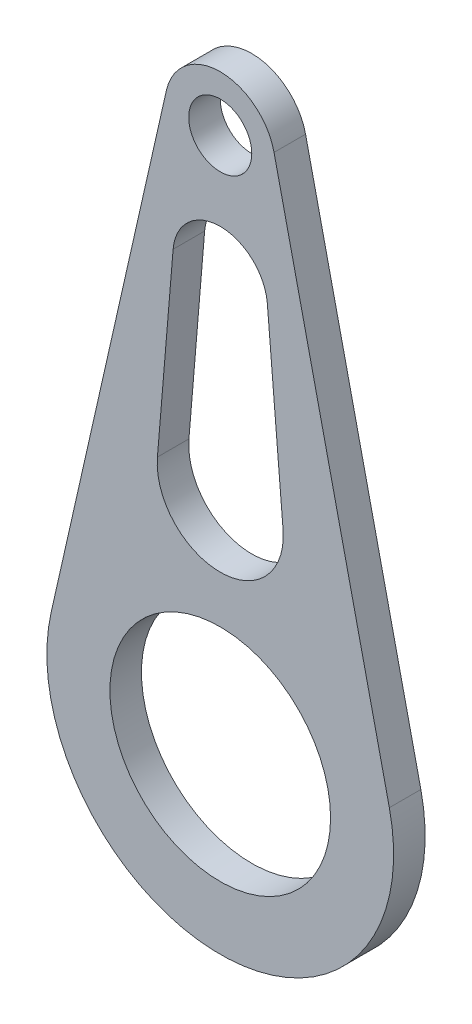
ISO-10303-21;
HEADER;
FILE_DESCRIPTION(('STEP AP214'),'2;1');
FILE_NAME('part.step','',(''),(''),'','','');
FILE_SCHEMA(('AUTOMOTIVE_DESIGN { 1 0 10303 214 1 1 1 1 }'));
ENDSEC;
DATA;
#1=APPLICATION_CONTEXT('core data for automotive mechanical design processes');
#2=APPLICATION_PROTOCOL_DEFINITION('international standard','automotive_design',2000,#1);
#3=PRODUCT_CONTEXT('',#1,'mechanical');
#4=PRODUCT('Part','Part','',(#3));
#5=PRODUCT_RELATED_PRODUCT_CATEGORY('part','',(#4));
#6=PRODUCT_DEFINITION_FORMATION('','',#4);
#7=PRODUCT_DEFINITION_CONTEXT('part definition',#1,'design');
#8=PRODUCT_DEFINITION('design','',#6,#7);
#9=PRODUCT_DEFINITION_SHAPE('','',#8);
#10=(LENGTH_UNIT() NAMED_UNIT(*) SI_UNIT(.MILLI.,.METRE.));
#11=(NAMED_UNIT(*) PLANE_ANGLE_UNIT() SI_UNIT($,.RADIAN.));
#12=(NAMED_UNIT(*) SI_UNIT($,.STERADIAN.) SOLID_ANGLE_UNIT());
#13=UNCERTAINTY_MEASURE_WITH_UNIT(LENGTH_MEASURE(1.E-05),#10,'distance_accuracy_value','');
#14=(GEOMETRIC_REPRESENTATION_CONTEXT(3) GLOBAL_UNCERTAINTY_ASSIGNED_CONTEXT((#13)) GLOBAL_UNIT_ASSIGNED_CONTEXT((#10,
#11,#12)) REPRESENTATION_CONTEXT('',''));
#15=CARTESIAN_POINT('',(0.,0.,0.));
#16=DIRECTION('',(0.,0.,1.));
#17=DIRECTION('',(1.,0.,0.));
#18=AXIS2_PLACEMENT_3D('',#15,#16,#17);
#19=CARTESIAN_POINT('',(0.,34.,2.));
#20=DIRECTION('',(0.,0.,1.));
#21=DIRECTION('',(1.,0.,0.));
#22=AXIS2_PLACEMENT_3D('',#19,#20,#21);
#23=PLANE('',#22);
#24=DIRECTION('',(-0.0833333333333333,0.996521728591783,0.));
#25=VECTOR('',#24,1.);
#26=CARTESIAN_POINT('',(2.98956518577535,26.25,2.));
#27=LINE('',#26,#25);
#28=CARTESIAN_POINT('',(3.98608691436713,14.3333333333333,2.));
#29=VERTEX_POINT('',#28);
#30=CARTESIAN_POINT('',(2.98956518577535,26.25,2.));
#31=VERTEX_POINT('',#30);
#32=EDGE_CURVE('E107',#29,#31,#27,.T.);
#33=ORIENTED_EDGE('',*,*,#32,.F.);
#34=CARTESIAN_POINT('',(0.,14.,2.));
#35=DIRECTION('',(0.,0.,1.));
#36=DIRECTION('',(1.,0.,0.));
#37=AXIS2_PLACEMENT_3D('',#34,#35,#36);
#38=CIRCLE('',#37,4.);
#39=CARTESIAN_POINT('',(-3.98608691436713,14.3333333333333,2.));
#40=VERTEX_POINT('',#39);
#41=EDGE_CURVE('E99',#40,#29,#38,.T.);
#42=ORIENTED_EDGE('',*,*,#41,.F.);
#43=DIRECTION('',(-0.0833333333333335,-0.996521728591783,0.));
#44=VECTOR('',#43,1.);
#45=CARTESIAN_POINT('',(-2.98956518577535,26.25,2.));
#46=LINE('',#45,#44);
#47=CARTESIAN_POINT('',(-2.98956518577535,26.25,2.));
#48=VERTEX_POINT('',#47);
#49=EDGE_CURVE('E122',#48,#40,#46,.T.);
#50=ORIENTED_EDGE('',*,*,#49,.F.);
#51=CARTESIAN_POINT('',(0.,26.,2.));
#52=DIRECTION('',(0.,0.,1.));
#53=DIRECTION('',(1.,0.,0.));
#54=AXIS2_PLACEMENT_3D('',#51,#52,#53);
#55=CIRCLE('',#54,3.);
#56=EDGE_CURVE('E120',#31,#48,#55,.T.);
#57=ORIENTED_EDGE('',*,*,#56,.F.);
#58=EDGE_LOOP('',(#33,#42,#50,#57));
#59=FACE_BOUND('',#58,.T.);
#60=CARTESIAN_POINT('',(0.,0.,2.));
#61=DIRECTION('',(0.,0.,1.));
#62=DIRECTION('',(1.,0.,0.));
#63=AXIS2_PLACEMENT_3D('',#60,#61,#62);
#64=CIRCLE('',#63,7.);
#65=CARTESIAN_POINT('',(7.,0.,2.));
#66=VERTEX_POINT('',#65);
#67=EDGE_CURVE('E138',#66,#66,#64,.T.);
#68=ORIENTED_EDGE('',*,*,#67,.F.);
#69=EDGE_LOOP('',(#68));
#70=FACE_BOUND('',#69,.T.);
#71=CARTESIAN_POINT('',(0.,34.,2.));
#72=DIRECTION('',(0.,0.,1.));
#73=DIRECTION('',(1.,0.,0.));
#74=AXIS2_PLACEMENT_3D('',#71,#72,#73);
#75=CIRCLE('',#74,3.5);
#76=CARTESIAN_POINT('',(3.41378458210391,34.7720588235294,2.));
#77=VERTEX_POINT('',#76);
#78=CARTESIAN_POINT('',(-3.41378458210391,34.7720588235294,2.));
#79=VERTEX_POINT('',#78);
#80=EDGE_CURVE('E144',#77,#79,#75,.T.);
#81=ORIENTED_EDGE('',*,*,#80,.T.);
#82=DIRECTION('',(-0.220588235294118,-0.975367023458261,0.));
#83=VECTOR('',#82,1.);
#84=CARTESIAN_POINT('',(-3.41378458210391,34.7720588235294,2.));
#85=LINE('',#84,#83);
#86=CARTESIAN_POINT('',(-10.7290372580409,2.42647058823529,2.));
#87=VERTEX_POINT('',#86);
#88=EDGE_CURVE('E147',#79,#87,#85,.T.);
#89=ORIENTED_EDGE('',*,*,#88,.T.);
#90=CARTESIAN_POINT('',(0.,0.,2.));
#91=DIRECTION('',(0.,0.,1.));
#92=DIRECTION('',(1.,0.,0.));
#93=AXIS2_PLACEMENT_3D('',#90,#91,#92);
#94=CIRCLE('',#93,11.);
#95=CARTESIAN_POINT('',(10.7290372580409,2.42647058823529,2.));
#96=VERTEX_POINT('',#95);
#97=EDGE_CURVE('E150',#87,#96,#94,.T.);
#98=ORIENTED_EDGE('',*,*,#97,.T.);
#99=DIRECTION('',(-0.220588235294117,0.975367023458261,0.));
#100=VECTOR('',#99,1.);
#101=CARTESIAN_POINT('',(3.41378458210391,34.7720588235294,2.));
#102=LINE('',#101,#100);
#103=EDGE_CURVE('E152',#96,#77,#102,.T.);
#104=ORIENTED_EDGE('',*,*,#103,.T.);
#105=EDGE_LOOP('',(#81,#89,#98,#104));
#106=FACE_BOUND('',#105,.T.);
#107=CARTESIAN_POINT('',(0.,34.,2.));
#108=DIRECTION('',(0.,0.,1.));
#109=DIRECTION('',(1.,0.,0.));
#110=AXIS2_PLACEMENT_3D('',#107,#108,#109);
#111=CIRCLE('',#110,2.);
#112=CARTESIAN_POINT('',(2.,34.,2.));
#113=VERTEX_POINT('',#112);
#114=EDGE_CURVE('E128',#113,#113,#111,.T.);
#115=ORIENTED_EDGE('',*,*,#114,.F.);
#116=EDGE_LOOP('',(#115));
#117=FACE_BOUND('',#116,.T.);
#118=ADVANCED_FACE('F34',(#59,#70,#106,#117),#23,.T.);
#119=CARTESIAN_POINT('',(0.,34.,0.));
#120=DIRECTION('',(0.,0.,1.));
#121=DIRECTION('',(1.,0.,0.));
#122=AXIS2_PLACEMENT_3D('',#119,#120,#121);
#123=PLANE('',#122);
#124=CARTESIAN_POINT('',(0.,0.,0.));
#125=DIRECTION('',(0.,0.,1.));
#126=DIRECTION('',(1.,0.,0.));
#127=AXIS2_PLACEMENT_3D('',#124,#125,#126);
#128=CIRCLE('',#127,7.);
#129=CARTESIAN_POINT('',(7.,0.,0.));
#130=VERTEX_POINT('',#129);
#131=EDGE_CURVE('E115',#130,#130,#128,.T.);
#132=ORIENTED_EDGE('',*,*,#131,.T.);
#133=EDGE_LOOP('',(#132));
#134=FACE_BOUND('',#133,.T.);
#135=CARTESIAN_POINT('',(0.,34.,0.));
#136=DIRECTION('',(0.,0.,1.));
#137=DIRECTION('',(1.,0.,0.));
#138=AXIS2_PLACEMENT_3D('',#135,#136,#137);
#139=CIRCLE('',#138,3.5);
#140=CARTESIAN_POINT('',(3.41378458210391,34.7720588235294,0.));
#141=VERTEX_POINT('',#140);
#142=CARTESIAN_POINT('',(-3.41378458210391,34.7720588235294,0.));
#143=VERTEX_POINT('',#142);
#144=EDGE_CURVE('E141',#141,#143,#139,.T.);
#145=ORIENTED_EDGE('',*,*,#144,.F.);
#146=DIRECTION('',(-0.220588235294117,0.975367023458261,0.));
#147=VECTOR('',#146,1.);
#148=CARTESIAN_POINT('',(3.41378458210391,34.7720588235294,0.));
#149=LINE('',#148,#147);
#150=CARTESIAN_POINT('',(10.7290372580409,2.42647058823529,0.));
#151=VERTEX_POINT('',#150);
#152=EDGE_CURVE('E148',#151,#141,#149,.T.);
#153=ORIENTED_EDGE('',*,*,#152,.F.);
#154=CARTESIAN_POINT('',(0.,0.,0.));
#155=DIRECTION('',(0.,0.,1.));
#156=DIRECTION('',(1.,0.,0.));
#157=AXIS2_PLACEMENT_3D('',#154,#155,#156);
#158=CIRCLE('',#157,11.);
#159=CARTESIAN_POINT('',(-10.7290372580409,2.42647058823529,0.));
#160=VERTEX_POINT('',#159);
#161=EDGE_CURVE('E159',#160,#151,#158,.T.);
#162=ORIENTED_EDGE('',*,*,#161,.F.);
#163=DIRECTION('',(-0.220588235294118,-0.975367023458261,0.));
#164=VECTOR('',#163,1.);
#165=CARTESIAN_POINT('',(-3.41378458210391,34.7720588235294,0.));
#166=LINE('',#165,#164);
#167=EDGE_CURVE('E157',#143,#160,#166,.T.);
#168=ORIENTED_EDGE('',*,*,#167,.F.);
#169=EDGE_LOOP('',(#145,#153,#162,#168));
#170=FACE_BOUND('',#169,.T.);
#171=CARTESIAN_POINT('',(0.,14.,0.));
#172=DIRECTION('',(0.,0.,1.));
#173=DIRECTION('',(1.,0.,0.));
#174=AXIS2_PLACEMENT_3D('',#171,#172,#173);
#175=CIRCLE('',#174,4.);
#176=CARTESIAN_POINT('',(-3.98608691436713,14.3333333333333,0.));
#177=VERTEX_POINT('',#176);
#178=CARTESIAN_POINT('',(3.98608691436713,14.3333333333333,0.));
#179=VERTEX_POINT('',#178);
#180=EDGE_CURVE('E57',#177,#179,#175,.T.);
#181=ORIENTED_EDGE('',*,*,#180,.T.);
#182=DIRECTION('',(-0.0833333333333333,0.996521728591783,0.));
#183=VECTOR('',#182,1.);
#184=CARTESIAN_POINT('',(2.98956518577535,26.25,0.));
#185=LINE('',#184,#183);
#186=CARTESIAN_POINT('',(2.98956518577535,26.25,0.));
#187=VERTEX_POINT('',#186);
#188=EDGE_CURVE('E114',#179,#187,#185,.T.);
#189=ORIENTED_EDGE('',*,*,#188,.T.);
#190=CARTESIAN_POINT('',(0.,26.,0.));
#191=DIRECTION('',(0.,0.,1.));
#192=DIRECTION('',(1.,0.,0.));
#193=AXIS2_PLACEMENT_3D('',#190,#191,#192);
#194=CIRCLE('',#193,3.);
#195=CARTESIAN_POINT('',(-2.98956518577535,26.25,0.));
#196=VERTEX_POINT('',#195);
#197=EDGE_CURVE('E130',#187,#196,#194,.T.);
#198=ORIENTED_EDGE('',*,*,#197,.T.);
#199=DIRECTION('',(-0.0833333333333335,-0.996521728591783,0.));
#200=VECTOR('',#199,1.);
#201=CARTESIAN_POINT('',(-2.98956518577535,26.25,0.));
#202=LINE('',#201,#200);
#203=EDGE_CURVE('E108',#196,#177,#202,.T.);
#204=ORIENTED_EDGE('',*,*,#203,.T.);
#205=EDGE_LOOP('',(#181,#189,#198,#204));
#206=FACE_BOUND('',#205,.T.);
#207=CARTESIAN_POINT('',(0.,34.,0.));
#208=DIRECTION('',(0.,0.,1.));
#209=DIRECTION('',(1.,0.,0.));
#210=AXIS2_PLACEMENT_3D('',#207,#208,#209);
#211=CIRCLE('',#210,2.);
#212=CARTESIAN_POINT('',(2.,34.,0.));
#213=VERTEX_POINT('',#212);
#214=EDGE_CURVE('E239',#213,#213,#211,.T.);
#215=ORIENTED_EDGE('',*,*,#214,.T.);
#216=EDGE_LOOP('',(#215));
#217=FACE_BOUND('',#216,.T.);
#218=ADVANCED_FACE('F177',(#134,#170,#206,#217),#123,.F.);
#219=CARTESIAN_POINT('',(0.,34.,2.));
#220=DIRECTION('',(0.,0.,-1.));
#221=DIRECTION('',(-1.,0.,0.));
#222=AXIS2_PLACEMENT_3D('',#219,#220,#221);
#223=CYLINDRICAL_SURFACE('',#222,3.5);
#224=ORIENTED_EDGE('',*,*,#144,.T.);
#225=DIRECTION('',(0.,0.,-1.));
#226=VECTOR('',#225,1.);
#227=CARTESIAN_POINT('',(-3.41378458210391,34.7720588235294,2.));
#228=LINE('',#227,#226);
#229=EDGE_CURVE('E11',#79,#143,#228,.T.);
#230=ORIENTED_EDGE('',*,*,#229,.F.);
#231=ORIENTED_EDGE('',*,*,#80,.F.);
#232=DIRECTION('',(0.,0.,-1.));
#233=VECTOR('',#232,1.);
#234=CARTESIAN_POINT('',(3.41378458210391,34.7720588235294,2.));
#235=LINE('',#234,#233);
#236=EDGE_CURVE('E154',#77,#141,#235,.T.);
#237=ORIENTED_EDGE('',*,*,#236,.T.);
#238=EDGE_LOOP('',(#224,#230,#231,#237));
#239=FACE_BOUND('',#238,.T.);
#240=ADVANCED_FACE('F36',(#239),#223,.T.);
#241=CARTESIAN_POINT('',(-3.41378458210391,34.7720588235294,2.));
#242=DIRECTION('',(0.975367023458261,-0.220588235294118,0.));
#243=DIRECTION('',(0.220588235294118,0.975367023458261,0.));
#244=AXIS2_PLACEMENT_3D('',#241,#242,#243);
#245=PLANE('',#244);
#246=ORIENTED_EDGE('',*,*,#167,.T.);
#247=DIRECTION('',(0.,0.,-1.));
#248=VECTOR('',#247,1.);
#249=CARTESIAN_POINT('',(-10.7290372580409,2.42647058823529,2.));
#250=LINE('',#249,#248);
#251=EDGE_CURVE('E42',#87,#160,#250,.T.);
#252=ORIENTED_EDGE('',*,*,#251,.F.);
#253=ORIENTED_EDGE('',*,*,#88,.F.);
#254=ORIENTED_EDGE('',*,*,#229,.T.);
#255=EDGE_LOOP('',(#246,#252,#253,#254));
#256=FACE_BOUND('',#255,.T.);
#257=ADVANCED_FACE('F188',(#256),#245,.F.);
#258=CARTESIAN_POINT('',(0.,0.,2.));
#259=DIRECTION('',(0.,0.,-1.));
#260=DIRECTION('',(-1.,0.,0.));
#261=AXIS2_PLACEMENT_3D('',#258,#259,#260);
#262=CYLINDRICAL_SURFACE('',#261,11.);
#263=ORIENTED_EDGE('',*,*,#161,.T.);
#264=DIRECTION('',(0.,0.,-1.));
#265=VECTOR('',#264,1.);
#266=CARTESIAN_POINT('',(10.7290372580409,2.42647058823529,2.));
#267=LINE('',#266,#265);
#268=EDGE_CURVE('E164',#96,#151,#267,.T.);
#269=ORIENTED_EDGE('',*,*,#268,.F.);
#270=ORIENTED_EDGE('',*,*,#97,.F.);
#271=ORIENTED_EDGE('',*,*,#251,.T.);
#272=EDGE_LOOP('',(#263,#269,#270,#271));
#273=FACE_BOUND('',#272,.T.);
#274=ADVANCED_FACE('F171',(#273),#262,.T.);
#275=CARTESIAN_POINT('',(3.41378458210391,34.7720588235294,2.));
#276=DIRECTION('',(-0.975367023458261,-0.220588235294117,0.));
#277=DIRECTION('',(0.220588235294117,-0.975367023458261,0.));
#278=AXIS2_PLACEMENT_3D('',#275,#276,#277);
#279=PLANE('',#278);
#280=ORIENTED_EDGE('',*,*,#152,.T.);
#281=ORIENTED_EDGE('',*,*,#236,.F.);
#282=ORIENTED_EDGE('',*,*,#103,.F.);
#283=ORIENTED_EDGE('',*,*,#268,.T.);
#284=EDGE_LOOP('',(#280,#281,#282,#283));
#285=FACE_BOUND('',#284,.T.);
#286=ADVANCED_FACE('F181',(#285),#279,.F.);
#287=CARTESIAN_POINT('',(0.,0.,2.));
#288=DIRECTION('',(0.,0.,-1.));
#289=DIRECTION('',(-1.,0.,0.));
#290=AXIS2_PLACEMENT_3D('',#287,#288,#289);
#291=CYLINDRICAL_SURFACE('',#290,7.);
#292=ORIENTED_EDGE('',*,*,#67,.T.);
#293=EDGE_LOOP('',(#292));
#294=FACE_BOUND('',#293,.T.);
#295=ORIENTED_EDGE('',*,*,#131,.F.);
#296=EDGE_LOOP('',(#295));
#297=FACE_BOUND('',#296,.T.);
#298=ADVANCED_FACE('F203',(#294,#297),#291,.F.);
#299=CARTESIAN_POINT('',(0.,14.,2.));
#300=DIRECTION('',(0.,0.,-1.));
#301=DIRECTION('',(-1.,0.,0.));
#302=AXIS2_PLACEMENT_3D('',#299,#300,#301);
#303=CYLINDRICAL_SURFACE('',#302,4.);
#304=ORIENTED_EDGE('',*,*,#180,.F.);
#305=DIRECTION('',(0.,0.,-1.));
#306=VECTOR('',#305,1.);
#307=CARTESIAN_POINT('',(-3.98608691436713,14.3333333333333,2.));
#308=LINE('',#307,#306);
#309=EDGE_CURVE('E103',#40,#177,#308,.T.);
#310=ORIENTED_EDGE('',*,*,#309,.F.);
#311=ORIENTED_EDGE('',*,*,#41,.T.);
#312=DIRECTION('',(0.,0.,-1.));
#313=VECTOR('',#312,1.);
#314=CARTESIAN_POINT('',(3.98608691436713,14.3333333333333,2.));
#315=LINE('',#314,#313);
#316=EDGE_CURVE('E102',#29,#179,#315,.T.);
#317=ORIENTED_EDGE('',*,*,#316,.T.);
#318=EDGE_LOOP('',(#304,#310,#311,#317));
#319=FACE_BOUND('',#318,.T.);
#320=ADVANCED_FACE('F101',(#319),#303,.F.);
#321=CARTESIAN_POINT('',(2.98956518577535,26.25,2.));
#322=DIRECTION('',(-0.996521728591783,-0.0833333333333333,0.));
#323=DIRECTION('',(0.0833333333333333,-0.996521728591783,0.));
#324=AXIS2_PLACEMENT_3D('',#321,#322,#323);
#325=PLANE('',#324);
#326=ORIENTED_EDGE('',*,*,#188,.F.);
#327=ORIENTED_EDGE('',*,*,#316,.F.);
#328=ORIENTED_EDGE('',*,*,#32,.T.);
#329=DIRECTION('',(0.,0.,-1.));
#330=VECTOR('',#329,1.);
#331=CARTESIAN_POINT('',(2.98956518577535,26.25,2.));
#332=LINE('',#331,#330);
#333=EDGE_CURVE('E116',#31,#187,#332,.T.);
#334=ORIENTED_EDGE('',*,*,#333,.T.);
#335=EDGE_LOOP('',(#326,#327,#328,#334));
#336=FACE_BOUND('',#335,.T.);
#337=ADVANCED_FACE('F111',(#336),#325,.T.);
#338=CARTESIAN_POINT('',(0.,26.,2.));
#339=DIRECTION('',(0.,0.,-1.));
#340=DIRECTION('',(-1.,0.,0.));
#341=AXIS2_PLACEMENT_3D('',#338,#339,#340);
#342=CYLINDRICAL_SURFACE('',#341,3.);
#343=ORIENTED_EDGE('',*,*,#197,.F.);
#344=ORIENTED_EDGE('',*,*,#333,.F.);
#345=ORIENTED_EDGE('',*,*,#56,.T.);
#346=DIRECTION('',(0.,0.,-1.));
#347=VECTOR('',#346,1.);
#348=CARTESIAN_POINT('',(-2.98956518577535,26.25,2.));
#349=LINE('',#348,#347);
#350=EDGE_CURVE('E49',#48,#196,#349,.T.);
#351=ORIENTED_EDGE('',*,*,#350,.T.);
#352=EDGE_LOOP('',(#343,#344,#345,#351));
#353=FACE_BOUND('',#352,.T.);
#354=ADVANCED_FACE('F220',(#353),#342,.F.);
#355=CARTESIAN_POINT('',(-2.98956518577535,26.25,2.));
#356=DIRECTION('',(0.996521728591783,-0.0833333333333335,0.));
#357=DIRECTION('',(0.0833333333333335,0.996521728591783,0.));
#358=AXIS2_PLACEMENT_3D('',#355,#356,#357);
#359=PLANE('',#358);
#360=ORIENTED_EDGE('',*,*,#203,.F.);
#361=ORIENTED_EDGE('',*,*,#350,.F.);
#362=ORIENTED_EDGE('',*,*,#49,.T.);
#363=ORIENTED_EDGE('',*,*,#309,.T.);
#364=EDGE_LOOP('',(#360,#361,#362,#363));
#365=FACE_BOUND('',#364,.T.);
#366=ADVANCED_FACE('F225',(#365),#359,.T.);
#367=CARTESIAN_POINT('',(0.,34.,2.));
#368=DIRECTION('',(0.,0.,-1.));
#369=DIRECTION('',(-1.,0.,0.));
#370=AXIS2_PLACEMENT_3D('',#367,#368,#369);
#371=CYLINDRICAL_SURFACE('',#370,2.);
#372=ORIENTED_EDGE('',*,*,#114,.T.);
#373=EDGE_LOOP('',(#372));
#374=FACE_BOUND('',#373,.T.);
#375=ORIENTED_EDGE('',*,*,#214,.F.);
#376=EDGE_LOOP('',(#375));
#377=FACE_BOUND('',#376,.T.);
#378=ADVANCED_FACE('F229',(#374,#377),#371,.F.);
#379=CLOSED_SHELL('',(#118,#218,#240,#257,#274,#286,#298,#320,#337,#354,#366,#378));
#380=MANIFOLD_SOLID_BREP('B2',#379);
#381=ADVANCED_BREP_SHAPE_REPRESENTATION('',(#18,#380),#14);
#382=SHAPE_DEFINITION_REPRESENTATION(#9,#381);
ENDSEC;
END-ISO-10303-21;
